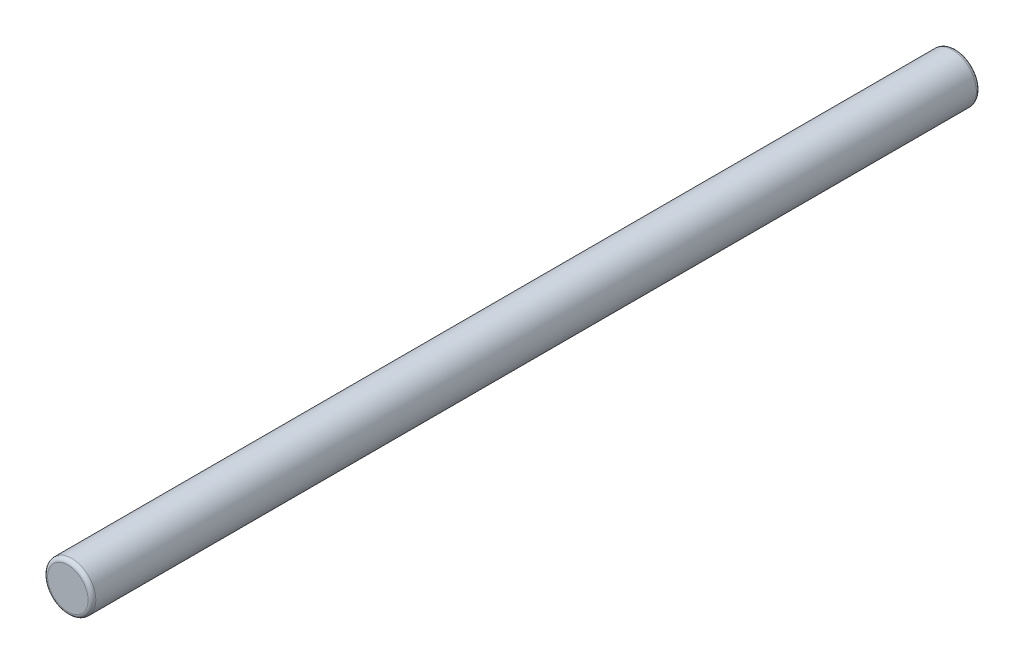
ISO-10303-21;
HEADER;
FILE_DESCRIPTION(('STEP AP214'),'2;1');
FILE_NAME('part.step','',(''),(''),'','','');
FILE_SCHEMA(('AUTOMOTIVE_DESIGN { 1 0 10303 214 1 1 1 1 }'));
ENDSEC;
DATA;
#1=APPLICATION_CONTEXT('core data for automotive mechanical design processes');
#2=APPLICATION_PROTOCOL_DEFINITION('international standard','automotive_design',2000,#1);
#3=PRODUCT_CONTEXT('',#1,'mechanical');
#4=PRODUCT('Part','Part','',(#3));
#5=PRODUCT_RELATED_PRODUCT_CATEGORY('part','',(#4));
#6=PRODUCT_DEFINITION_FORMATION('','',#4);
#7=PRODUCT_DEFINITION_CONTEXT('part definition',#1,'design');
#8=PRODUCT_DEFINITION('design','',#6,#7);
#9=PRODUCT_DEFINITION_SHAPE('','',#8);
#10=(LENGTH_UNIT() NAMED_UNIT(*) SI_UNIT(.MILLI.,.METRE.));
#11=(NAMED_UNIT(*) PLANE_ANGLE_UNIT() SI_UNIT($,.RADIAN.));
#12=(NAMED_UNIT(*) SI_UNIT($,.STERADIAN.) SOLID_ANGLE_UNIT());
#13=UNCERTAINTY_MEASURE_WITH_UNIT(LENGTH_MEASURE(1.E-05),#10,'distance_accuracy_value','');
#14=(GEOMETRIC_REPRESENTATION_CONTEXT(3) GLOBAL_UNCERTAINTY_ASSIGNED_CONTEXT((#13)) GLOBAL_UNIT_ASSIGNED_CONTEXT((#10,
#11,#12)) REPRESENTATION_CONTEXT('',''));
#15=CARTESIAN_POINT('',(0.,0.,0.));
#16=DIRECTION('',(0.,0.,1.));
#17=DIRECTION('',(1.,0.,0.));
#18=AXIS2_PLACEMENT_3D('',#15,#16,#17);
#19=CARTESIAN_POINT('',(0.,0.,-230.));
#20=DIRECTION('',(0.,0.,1.));
#21=DIRECTION('',(1.,0.,0.));
#22=AXIS2_PLACEMENT_3D('',#19,#20,#21);
#23=CYLINDRICAL_SURFACE('',#22,12.5);
#24=CARTESIAN_POINT('',(0.,0.,228.));
#25=DIRECTION('',(0.,0.,1.));
#26=DIRECTION('',(1.,0.,0.));
#27=AXIS2_PLACEMENT_3D('',#24,#25,#26);
#28=CIRCLE('',#27,12.5);
#29=CARTESIAN_POINT('',(12.5,0.,228.));
#30=VERTEX_POINT('',#29);
#31=EDGE_CURVE('E43',#30,#30,#28,.F.);
#32=ORIENTED_EDGE('',*,*,#31,.T.);
#33=EDGE_LOOP('',(#32));
#34=FACE_BOUND('',#33,.T.);
#35=CARTESIAN_POINT('',(0.,0.,-228.));
#36=DIRECTION('',(0.,0.,1.));
#37=DIRECTION('',(1.,0.,0.));
#38=AXIS2_PLACEMENT_3D('',#35,#36,#37);
#39=CIRCLE('',#38,12.5);
#40=CARTESIAN_POINT('',(12.5,0.,-228.));
#41=VERTEX_POINT('',#40);
#42=EDGE_CURVE('E47',#41,#41,#39,.T.);
#43=ORIENTED_EDGE('',*,*,#42,.T.);
#44=EDGE_LOOP('',(#43));
#45=FACE_BOUND('',#44,.T.);
#46=CARTESIAN_POINT('',(0.,-12.5,-95.75));
#47=CARTESIAN_POINT('',(-0.231629316585797,-12.5000013493631,-95.7499979669659));
#48=CARTESIAN_POINT('',(-0.463244602260155,-12.493502868787,-95.7689973329538));
#49=CARTESIAN_POINT('',(-0.919637198733393,-12.4682205879803,-95.8442489490701));
#50=CARTESIAN_POINT('',(-1.14441406994913,-12.4494359997198,-95.9005035887512));
#51=CARTESIAN_POINT('',(-1.58048439723265,-12.4016188733298,-96.0481034619945));
#52=CARTESIAN_POINT('',(-1.79180021823002,-12.3726038861914,-96.139388621713));
#53=CARTESIAN_POINT('',(-2.1961203899874,-12.3072763657775,-96.3541815188156));
#54=CARTESIAN_POINT('',(-2.38912089291744,-12.270962304028,-96.4776960068501));
#55=CARTESIAN_POINT('',(-2.75825261944735,-12.1933910285169,-96.7580893081019));
#56=CARTESIAN_POINT('',(-2.93363688121843,-12.1520119725704,-96.9159175578781));
#57=CARTESIAN_POINT('',(-3.25602333800846,-12.069633438027,-97.2584402990818));
#58=CARTESIAN_POINT('',(-3.40301894005995,-12.0286340497037,-97.4431410139358));
#59=CARTESIAN_POINT('',(-3.66879190776175,-11.9503048632061,-97.8409772793939));
#60=CARTESIAN_POINT('',(-3.78658554363525,-11.9131228611846,-98.0548019294764));
#61=CARTESIAN_POINT('',(-3.98421855180598,-11.8484975327096,-98.500694660626));
#62=CARTESIAN_POINT('',(-4.06407004270031,-11.8210510974587,-98.7327568890351));
#63=CARTESIAN_POINT('',(-4.180727158555,-11.7802904138908,-99.2000245327279));
#64=CARTESIAN_POINT('',(-4.21893677153849,-11.7665167255043,-99.4348381398489));
#65=CARTESIAN_POINT('',(-4.2556150496915,-11.7533040945085,-99.9079165066641));
#66=CARTESIAN_POINT('',(-4.25409658909983,-11.7538605081001,-100.146180123337));
#67=CARTESIAN_POINT('',(-4.21244934024964,-11.7688435667819,-100.607294945829));
#68=CARTESIAN_POINT('',(-4.1741694203804,-11.7826060062583,-100.830338503845));
#69=CARTESIAN_POINT('',(-4.06310816523945,-11.8213609901718,-101.266625487524));
#70=CARTESIAN_POINT('',(-3.99032254229153,-11.8463549302143,-101.479867691658));
#71=CARTESIAN_POINT('',(-3.81113653039608,-11.9052184288415,-101.894632371216));
#72=CARTESIAN_POINT('',(-3.70419900732797,-11.9392282253861,-102.095902028559));
#73=CARTESIAN_POINT('',(-3.46011773998613,-12.0122344758095,-102.478217073873));
#74=CARTESIAN_POINT('',(-3.3229649914025,-12.0512324147271,-102.659256408801));
#75=CARTESIAN_POINT('',(-3.01353124215082,-12.1324166416207,-103.006338510284));
#76=CARTESIAN_POINT('',(-2.83974395035441,-12.1746609041245,-103.171027643542));
#77=CARTESIAN_POINT('',(-2.4665017699171,-12.2557250188891,-103.469285327745));
#78=CARTESIAN_POINT('',(-2.26704421977735,-12.294544515365,-103.602850647723));
#79=CARTESIAN_POINT('',(-1.84516436753421,-12.3649312356261,-103.836218279975));
#80=CARTESIAN_POINT('',(-1.62251944687187,-12.3964165316577,-103.935644561776));
#81=CARTESIAN_POINT('',(-1.16233553494295,-12.4479909440337,-104.095207371087));
#82=CARTESIAN_POINT('',(-0.924801969927406,-12.4680841857644,-104.155358122582));
#83=CARTESIAN_POINT('',(-0.453032806948609,-12.4939206883818,-104.232233347978));
#84=CARTESIAN_POINT('',(-0.219127772365222,-12.5002675966187,-104.250785916481));
#85=CARTESIAN_POINT('',(0.248508234272233,-12.499715139365,-104.249163306665));
#86=CARTESIAN_POINT('',(0.482239229767981,-12.4928181125577,-104.228994965885));
#87=CARTESIAN_POINT('',(0.935487055917024,-12.4669514589193,-104.151941766037));
#88=CARTESIAN_POINT('',(1.15521999196989,-12.4483547937561,-104.096190454235));
#89=CARTESIAN_POINT('',(1.58211571473707,-12.4013331971436,-103.950982542174));
#90=CARTESIAN_POINT('',(1.78927688332145,-12.3729070036624,-103.861521613741));
#91=CARTESIAN_POINT('',(2.19135854363443,-12.3081499547371,-103.648776546221));
#92=CARTESIAN_POINT('',(2.3858005114391,-12.2716272117682,-103.524648109365));
#93=CARTESIAN_POINT('',(2.75168306551547,-12.1948041286534,-103.247077115213));
#94=CARTESIAN_POINT('',(2.9231163500378,-12.1545025961777,-103.09362528948));
#95=CARTESIAN_POINT('',(3.24657351287904,-12.0722386132383,-102.753172433502));
#96=CARTESIAN_POINT('',(3.39729328842665,-12.0302879182072,-102.564926512101));
#97=CARTESIAN_POINT('',(3.66518020873975,-11.9514023496921,-102.164922122001));
#98=CARTESIAN_POINT('',(3.78234674334563,-11.914467567428,-101.953163225819));
#99=CARTESIAN_POINT('',(3.97933669538634,-11.8501336294714,-101.511843319702));
#100=CARTESIAN_POINT('',(4.05920753889126,-11.8227223748612,-101.282305353715));
#101=CARTESIAN_POINT('',(4.17877629044749,-11.7809981443993,-100.811882432715));
#102=CARTESIAN_POINT('',(4.21849327320324,-11.7666789496003,-100.571002922363));
#103=CARTESIAN_POINT('',(4.2551029021973,-11.7534862510052,-100.098574729827));
#104=CARTESIAN_POINT('',(4.2541688433069,-11.7538288765012,-99.867214549356));
#105=CARTESIAN_POINT('',(4.21488538095235,-11.7679720866019,-99.4081334323596));
#106=CARTESIAN_POINT('',(4.17653837981658,-11.781771807111,-99.1804122631235));
#107=CARTESIAN_POINT('',(4.06508169516975,-11.8206793925214,-98.7397513300898));
#108=CARTESIAN_POINT('',(3.99270334550052,-11.8455487968498,-98.5266038613372));
#109=CARTESIAN_POINT('',(3.81583792726955,-11.9036971533386,-98.1153188310038));
#110=CARTESIAN_POINT('',(3.71134355482287,-11.9369780181425,-97.9171846965732));
#111=CARTESIAN_POINT('',(3.46772073523882,-12.0100690469571,-97.5318662951387));
#112=CARTESIAN_POINT('',(3.32724348872326,-12.0501058971147,-97.3455781255447));
#113=CARTESIAN_POINT('',(3.0178925601542,-12.1312763731794,-96.9985180089828));
#114=CARTESIAN_POINT('',(2.84901069833454,-12.1724103121393,-96.837753438124));
#115=CARTESIAN_POINT('',(2.47930158792251,-12.2531734329683,-96.5396203549197));
#116=CARTESIAN_POINT('',(2.2774454476222,-12.2926709568964,-96.4034874469842));
#117=CARTESIAN_POINT('',(1.85239769842136,-12.3638575017702,-96.1672194773996));
#118=CARTESIAN_POINT('',(1.62921053671336,-12.3955481454238,-96.0670769329436));
#119=CARTESIAN_POINT('',(1.17498554103731,-12.4466848305204,-95.9088004534038));
#120=CARTESIAN_POINT('',(0.94441337448045,-12.4664836857426,-95.8494476510786));
#121=CARTESIAN_POINT('',(0.475887689244042,-12.4931386057906,-95.7700544572626));
#122=CARTESIAN_POINT('',(0.237936441911585,-12.4999986138946,-95.7500020883924));
#123=CARTESIAN_POINT('',(0.,-12.5,-95.75));
#124=B_SPLINE_CURVE_WITH_KNOTS('',3,(#46,#47,#48,#49,#50,#51,#52,#53,#54,#55,#56,#57,#58,#59,
#60,#61,#62,#63,#64,#65,#66,#67,#68,#69,#70,#71,#72,#73,#74,#75,#76,#77,#78,#79,#80,#81,#82,#83,
#84,#85,#86,#87,#88,#89,#90,#91,#92,#93,#94,#95,#96,#97,#98,#99,#100,#101,#102,#103,#104,#105,
#106,#107,#108,#109,#110,#111,#112,#113,#114,#115,#116,#117,#118,#119,#120,#121,#122,#123),
.UNSPECIFIED.,.T.,.F.,(4,2,2,2,2,2,2,2,2,2,2,2,2,2,2,2,2,2,2,2,2,2,2,2,2,2,2,2,2,2,2,2,2,2,2,2,
2,2,4),(0.,0.69401203113552,1.38806858050573,2.08094017307815,2.77395700894338,3.48937549744917,
4.20495993509719,4.94210626785764,5.67901699996315,6.39023024980915,7.10121302747361,
7.77821403353029,8.45529918574264,9.14360628251112,9.83211877686468,10.558127208264,
11.2842109731308,12.0180534127162,12.7516299370932,13.4522781499046,14.1528026499667,
14.8320547208526,15.5113940346079,16.2089885679879,16.9068039604598,17.6376748123878,
18.368558954226,19.0985111385898,19.8281164030436,20.5187658396099,21.2093709316938,
21.8857695188882,22.5623220478608,23.2693695244284,23.976620961389,24.7129879656021,
25.4492017820332,26.1623287080454,26.8752382644273),.UNSPECIFIED.);
#125=CARTESIAN_POINT('',(0.,-12.5,-95.75));
#126=VERTEX_POINT('',#125);
#127=EDGE_CURVE('E56',#126,#126,#124,.T.);
#128=ORIENTED_EDGE('',*,*,#127,.F.);
#129=EDGE_LOOP('',(#128));
#130=FACE_BOUND('',#129,.T.);
#131=CARTESIAN_POINT('',(0.,-12.5,104.25));
#132=CARTESIAN_POINT('',(-0.231629316585797,-12.5000013493631,104.250002033034));
#133=CARTESIAN_POINT('',(-0.463244602260155,-12.493502868787,104.231002667046));
#134=CARTESIAN_POINT('',(-0.919637198733393,-12.4682205879803,104.15575105093));
#135=CARTESIAN_POINT('',(-1.14441406994913,-12.4494359997198,104.099496411249));
#136=CARTESIAN_POINT('',(-1.58048439723265,-12.4016188733298,103.951896538006));
#137=CARTESIAN_POINT('',(-1.79180021823002,-12.3726038861914,103.860611378287));
#138=CARTESIAN_POINT('',(-2.1961203899874,-12.3072763657775,103.645818481184));
#139=CARTESIAN_POINT('',(-2.38912089291744,-12.270962304028,103.52230399315));
#140=CARTESIAN_POINT('',(-2.75825261944735,-12.1933910285169,103.241910691898));
#141=CARTESIAN_POINT('',(-2.93363688121843,-12.1520119725704,103.084082442122));
#142=CARTESIAN_POINT('',(-3.25602333800846,-12.069633438027,102.741559700918));
#143=CARTESIAN_POINT('',(-3.40301894005995,-12.0286340497037,102.556858986064));
#144=CARTESIAN_POINT('',(-3.66879190776175,-11.9503048632061,102.159022720606));
#145=CARTESIAN_POINT('',(-3.78658554363525,-11.9131228611846,101.945198070524));
#146=CARTESIAN_POINT('',(-3.98421855180598,-11.8484975327096,101.499305339374));
#147=CARTESIAN_POINT('',(-4.06407004270031,-11.8210510974587,101.267243110965));
#148=CARTESIAN_POINT('',(-4.180727158555,-11.7802904138908,100.799975467272));
#149=CARTESIAN_POINT('',(-4.21893677153849,-11.7665167255043,100.565161860151));
#150=CARTESIAN_POINT('',(-4.2556150496915,-11.7533040945085,100.092083493336));
#151=CARTESIAN_POINT('',(-4.25409658909983,-11.7538605081001,99.8538198766629));
#152=CARTESIAN_POINT('',(-4.21244934024964,-11.7688435667819,99.3927050541706));
#153=CARTESIAN_POINT('',(-4.1741694203804,-11.7826060062583,99.1696614961546));
#154=CARTESIAN_POINT('',(-4.06310816523945,-11.8213609901718,98.733374512476));
#155=CARTESIAN_POINT('',(-3.99032254229152,-11.8463549302143,98.5201323083421));
#156=CARTESIAN_POINT('',(-3.81113653039608,-11.9052184288415,98.1053676287839));
#157=CARTESIAN_POINT('',(-3.70419900732797,-11.9392282253861,97.9040979714414));
#158=CARTESIAN_POINT('',(-3.46011773998613,-12.0122344758095,97.5217829261275));
#159=CARTESIAN_POINT('',(-3.3229649914025,-12.0512324147271,97.3407435911989));
#160=CARTESIAN_POINT('',(-3.01353124215081,-12.1324166416207,96.993661489716));
#161=CARTESIAN_POINT('',(-2.83974395035441,-12.1746609041245,96.8289723564576));
#162=CARTESIAN_POINT('',(-2.46650176991709,-12.2557250188891,96.530714672255));
#163=CARTESIAN_POINT('',(-2.26704421977735,-12.294544515365,96.397149352277));
#164=CARTESIAN_POINT('',(-1.84516436753421,-12.3649312356261,96.1637817200249));
#165=CARTESIAN_POINT('',(-1.62251944687187,-12.3964165316577,96.0643554382244));
#166=CARTESIAN_POINT('',(-1.16233553494295,-12.4479909440337,95.9047926289126));
#167=CARTESIAN_POINT('',(-0.924801969927404,-12.4680841857644,95.8446418774178));
#168=CARTESIAN_POINT('',(-0.453032806948609,-12.4939206883818,95.7677666520223));
#169=CARTESIAN_POINT('',(-0.219127772365222,-12.5002675966187,95.7492140835185));
#170=CARTESIAN_POINT('',(0.248508234272233,-12.499715139365,95.7508366933351));
#171=CARTESIAN_POINT('',(0.482239229767981,-12.4928181125577,95.7710050341146));
#172=CARTESIAN_POINT('',(0.935487055917024,-12.4669514589193,95.8480582339634));
#173=CARTESIAN_POINT('',(1.15521999196989,-12.4483547937561,95.9038095457653));
#174=CARTESIAN_POINT('',(1.58211571473707,-12.4013331971436,96.049017457826));
#175=CARTESIAN_POINT('',(1.78927688332145,-12.3729070036624,96.138478386259));
#176=CARTESIAN_POINT('',(2.19135854363444,-12.3081499547371,96.3512234537794));
#177=CARTESIAN_POINT('',(2.38580051143911,-12.2716272117682,96.475351890635));
#178=CARTESIAN_POINT('',(2.75168306551547,-12.1948041286534,96.7529228847875));
#179=CARTESIAN_POINT('',(2.9231163500378,-12.1545025961777,96.9063747105205));
#180=CARTESIAN_POINT('',(3.24657351287904,-12.0722386132383,97.2468275664985));
#181=CARTESIAN_POINT('',(3.39729328842666,-12.0302879182072,97.435073487899));
#182=CARTESIAN_POINT('',(3.66518020873976,-11.9514023496921,97.8350778779994));
#183=CARTESIAN_POINT('',(3.78234674334563,-11.914467567428,98.0468367741812));
#184=CARTESIAN_POINT('',(3.97933669538634,-11.8501336294714,98.4881566802981));
#185=CARTESIAN_POINT('',(4.05920753889126,-11.8227223748612,98.717694646285));
#186=CARTESIAN_POINT('',(4.17877629044749,-11.7809981443993,99.1881175672848));
#187=CARTESIAN_POINT('',(4.21849327320324,-11.7666789496003,99.4289970776366));
#188=CARTESIAN_POINT('',(4.2551029021973,-11.7534862510052,99.9014252701727));
#189=CARTESIAN_POINT('',(4.2541688433069,-11.7538288765012,100.132785450644));
#190=CARTESIAN_POINT('',(4.21488538095235,-11.7679720866019,100.59186656764));
#191=CARTESIAN_POINT('',(4.17653837981658,-11.781771807111,100.819587736877));
#192=CARTESIAN_POINT('',(4.06508169516975,-11.8206793925214,101.26024866991));
#193=CARTESIAN_POINT('',(3.99270334550052,-11.8455487968498,101.473396138663));
#194=CARTESIAN_POINT('',(3.81583792726954,-11.9036971533386,101.884681168996));
#195=CARTESIAN_POINT('',(3.71134355482286,-11.9369780181425,102.082815303427));
#196=CARTESIAN_POINT('',(3.46772073523882,-12.0100690469571,102.468133704861));
#197=CARTESIAN_POINT('',(3.32724348872326,-12.0501058971147,102.654421874455));
#198=CARTESIAN_POINT('',(3.0178925601542,-12.1312763731794,103.001481991017));
#199=CARTESIAN_POINT('',(2.84901069833454,-12.1724103121393,103.162246561876));
#200=CARTESIAN_POINT('',(2.47930158792251,-12.2531734329683,103.46037964508));
#201=CARTESIAN_POINT('',(2.2774454476222,-12.2926709568964,103.596512553016));
#202=CARTESIAN_POINT('',(1.85239769842136,-12.3638575017702,103.8327805226));
#203=CARTESIAN_POINT('',(1.62921053671336,-12.3955481454238,103.932923067056));
#204=CARTESIAN_POINT('',(1.17498554103731,-12.4466848305204,104.091199546596));
#205=CARTESIAN_POINT('',(0.94441337448045,-12.4664836857426,104.150552348921));
#206=CARTESIAN_POINT('',(0.475887689244042,-12.4931386057906,104.229945542737));
#207=CARTESIAN_POINT('',(0.237936441911585,-12.4999986138946,104.249997911608));
#208=CARTESIAN_POINT('',(0.,-12.5,104.25));
#209=B_SPLINE_CURVE_WITH_KNOTS('',3,(#131,#132,#133,#134,#135,#136,#137,#138,#139,#140,#141,
#142,#143,#144,#145,#146,#147,#148,#149,#150,#151,#152,#153,#154,#155,#156,#157,#158,#159,#160,
#161,#162,#163,#164,#165,#166,#167,#168,#169,#170,#171,#172,#173,#174,#175,#176,#177,#178,#179,
#180,#181,#182,#183,#184,#185,#186,#187,#188,#189,#190,#191,#192,#193,#194,#195,#196,#197,#198,
#199,#200,#201,#202,#203,#204,#205,#206,#207,#208),.UNSPECIFIED.,.T.,.F.,(4,2,2,2,2,2,2,2,2,2,2,
2,2,2,2,2,2,2,2,2,2,2,2,2,2,2,2,2,2,2,2,2,2,2,2,2,2,2,4),(0.,0.69401203113552,1.38806858050573,
2.08094017307815,2.77395700894338,3.48937549744917,4.20495993509719,4.94210626785764,
5.67901699996315,6.39023024980915,7.10121302747361,7.77821403353031,8.45529918574264,
9.14360628251113,9.83211877686468,10.5581272082641,11.2842109731308,12.0180534127162,
12.7516299370932,13.4522781499046,14.1528026499667,14.8320547208526,15.5113940346079,
16.2089885679879,16.9068039604598,17.6376748123879,18.368558954226,19.0985111385898,
19.8281164030437,20.5187658396099,21.2093709316938,21.8857695188882,22.5623220478608,
23.2693695244284,23.976620961389,24.7129879656021,25.4492017820332,26.1623287080454,
26.8752382644273),.UNSPECIFIED.);
#210=CARTESIAN_POINT('',(0.,-12.5,104.25));
#211=VERTEX_POINT('',#210);
#212=EDGE_CURVE('E64',#211,#211,#209,.T.);
#213=ORIENTED_EDGE('',*,*,#212,.F.);
#214=EDGE_LOOP('',(#213));
#215=FACE_BOUND('',#214,.T.);
#216=ADVANCED_FACE('F36',(#34,#45,#130,#215),#23,.T.);
#217=CARTESIAN_POINT('',(0.,0.,-230.));
#218=DIRECTION('',(0.,0.,1.));
#219=DIRECTION('',(1.,0.,0.));
#220=AXIS2_PLACEMENT_3D('',#217,#218,#219);
#221=PLANE('',#220);
#222=CARTESIAN_POINT('',(0.,0.,-230.));
#223=DIRECTION('',(0.,0.,1.));
#224=DIRECTION('',(1.,0.,0.));
#225=AXIS2_PLACEMENT_3D('',#222,#223,#224);
#226=CIRCLE('',#225,10.5);
#227=CARTESIAN_POINT('',(10.5,0.,-230.));
#228=VERTEX_POINT('',#227);
#229=EDGE_CURVE('E10',#228,#228,#226,.F.);
#230=ORIENTED_EDGE('',*,*,#229,.T.);
#231=EDGE_LOOP('',(#230));
#232=FACE_BOUND('',#231,.T.);
#233=ADVANCED_FACE('F89',(#232),#221,.F.);
#234=CARTESIAN_POINT('',(0.,0.,230.));
#235=DIRECTION('',(0.,0.,1.));
#236=DIRECTION('',(1.,0.,0.));
#237=AXIS2_PLACEMENT_3D('',#234,#235,#236);
#238=PLANE('',#237);
#239=CARTESIAN_POINT('',(0.,0.,230.));
#240=DIRECTION('',(0.,0.,1.));
#241=DIRECTION('',(1.,0.,0.));
#242=AXIS2_PLACEMENT_3D('',#239,#240,#241);
#243=CIRCLE('',#242,10.5);
#244=CARTESIAN_POINT('',(10.5,0.,230.));
#245=VERTEX_POINT('',#244);
#246=EDGE_CURVE('E51',#245,#245,#243,.T.);
#247=ORIENTED_EDGE('',*,*,#246,.T.);
#248=EDGE_LOOP('',(#247));
#249=FACE_BOUND('',#248,.T.);
#250=ADVANCED_FACE('F86',(#249),#238,.T.);
#251=CARTESIAN_POINT('',(0.,-50.,100.));
#252=DIRECTION('',(0.,1.,0.));
#253=DIRECTION('',(0.,0.,1.));
#254=AXIS2_PLACEMENT_3D('',#251,#252,#253);
#255=CYLINDRICAL_SURFACE('',#254,4.25);
#256=ORIENTED_EDGE('',*,*,#212,.T.);
#257=EDGE_LOOP('',(#256));
#258=FACE_BOUND('',#257,.T.);
#259=CARTESIAN_POINT('',(0.,0.,100.));
#260=DIRECTION('',(0.,1.,0.));
#261=DIRECTION('',(0.,0.,1.));
#262=AXIS2_PLACEMENT_3D('',#259,#260,#261);
#263=CIRCLE('',#262,4.25);
#264=CARTESIAN_POINT('',(0.,0.,104.25));
#265=VERTEX_POINT('',#264);
#266=EDGE_CURVE('E106',#265,#265,#263,.T.);
#267=ORIENTED_EDGE('',*,*,#266,.T.);
#268=EDGE_LOOP('',(#267));
#269=FACE_BOUND('',#268,.T.);
#270=ADVANCED_FACE('F81',(#258,#269),#255,.F.);
#271=CARTESIAN_POINT('',(0.,0.,100.));
#272=DIRECTION('',(0.,1.,0.));
#273=DIRECTION('',(0.,0.,1.));
#274=AXIS2_PLACEMENT_3D('',#271,#272,#273);
#275=PLANE('',#274);
#276=ORIENTED_EDGE('',*,*,#266,.F.);
#277=EDGE_LOOP('',(#276));
#278=FACE_BOUND('',#277,.T.);
#279=ADVANCED_FACE('F78',(#278),#275,.F.);
#280=CARTESIAN_POINT('',(0.,-50.,-100.));
#281=DIRECTION('',(0.,1.,0.));
#282=DIRECTION('',(0.,0.,1.));
#283=AXIS2_PLACEMENT_3D('',#280,#281,#282);
#284=CYLINDRICAL_SURFACE('',#283,4.25);
#285=ORIENTED_EDGE('',*,*,#127,.T.);
#286=EDGE_LOOP('',(#285));
#287=FACE_BOUND('',#286,.T.);
#288=CARTESIAN_POINT('',(0.,0.,-100.));
#289=DIRECTION('',(0.,1.,0.));
#290=DIRECTION('',(0.,0.,1.));
#291=AXIS2_PLACEMENT_3D('',#288,#289,#290);
#292=CIRCLE('',#291,4.25);
#293=CARTESIAN_POINT('',(0.,0.,-95.75));
#294=VERTEX_POINT('',#293);
#295=EDGE_CURVE('E104',#294,#294,#292,.T.);
#296=ORIENTED_EDGE('',*,*,#295,.T.);
#297=EDGE_LOOP('',(#296));
#298=FACE_BOUND('',#297,.T.);
#299=ADVANCED_FACE('F72',(#287,#298),#284,.F.);
#300=CARTESIAN_POINT('',(0.,0.,-100.));
#301=DIRECTION('',(0.,1.,0.));
#302=DIRECTION('',(0.,0.,1.));
#303=AXIS2_PLACEMENT_3D('',#300,#301,#302);
#304=PLANE('',#303);
#305=ORIENTED_EDGE('',*,*,#295,.F.);
#306=EDGE_LOOP('',(#305));
#307=FACE_BOUND('',#306,.T.);
#308=ADVANCED_FACE('F77',(#307),#304,.F.);
#309=CARTESIAN_POINT('',(0.,0.,228.));
#310=DIRECTION('',(0.,0.,1.));
#311=DIRECTION('',(1.,0.,0.));
#312=AXIS2_PLACEMENT_3D('',#309,#310,#311);
#313=TOROIDAL_SURFACE('',#312,10.5,2.);
#314=ORIENTED_EDGE('',*,*,#31,.F.);
#315=EDGE_LOOP('',(#314));
#316=FACE_BOUND('',#315,.T.);
#317=ORIENTED_EDGE('',*,*,#246,.F.);
#318=EDGE_LOOP('',(#317));
#319=FACE_BOUND('',#318,.T.);
#320=ADVANCED_FACE('F115',(#316,#319),#313,.T.);
#321=CARTESIAN_POINT('',(0.,0.,-228.));
#322=DIRECTION('',(0.,0.,1.));
#323=DIRECTION('',(1.,0.,0.));
#324=AXIS2_PLACEMENT_3D('',#321,#322,#323);
#325=TOROIDAL_SURFACE('',#324,10.5,2.);
#326=ORIENTED_EDGE('',*,*,#229,.F.);
#327=EDGE_LOOP('',(#326));
#328=FACE_BOUND('',#327,.T.);
#329=ORIENTED_EDGE('',*,*,#42,.F.);
#330=EDGE_LOOP('',(#329));
#331=FACE_BOUND('',#330,.T.);
#332=ADVANCED_FACE('F38',(#328,#331),#325,.T.);
#333=CLOSED_SHELL('',(#216,#233,#250,#270,#279,#299,#308,#320,#332));
#334=MANIFOLD_SOLID_BREP('B2',#333);
#335=ADVANCED_BREP_SHAPE_REPRESENTATION('',(#18,#334),#14);
#336=SHAPE_DEFINITION_REPRESENTATION(#9,#335);
ENDSEC;
END-ISO-10303-21;
